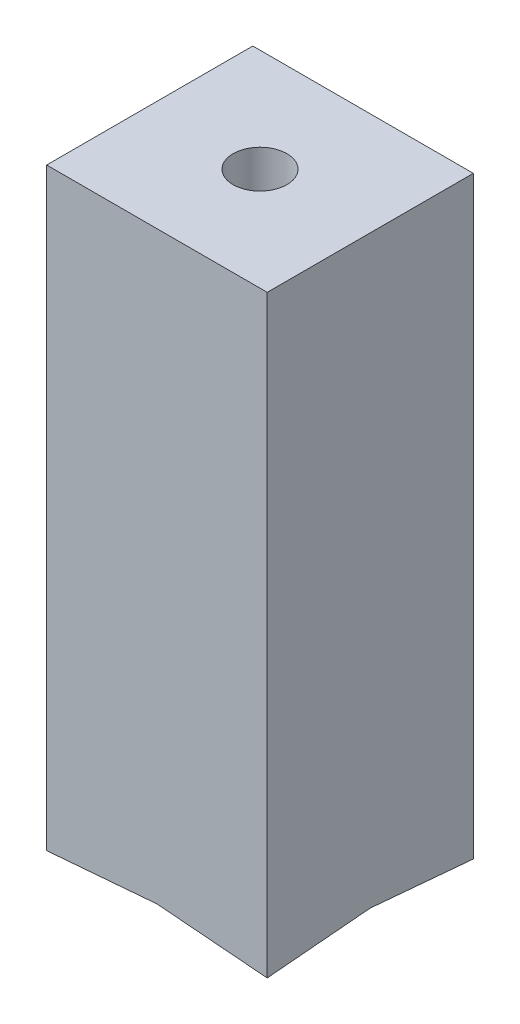
ISO-10303-21;
HEADER;
FILE_DESCRIPTION(('STEP AP214'),'2;1');
FILE_NAME('part.step','',(''),(''),'','','');
FILE_SCHEMA(('AUTOMOTIVE_DESIGN { 1 0 10303 214 1 1 1 1 }'));
ENDSEC;
DATA;
#1=APPLICATION_CONTEXT('core data for automotive mechanical design processes');
#2=APPLICATION_PROTOCOL_DEFINITION('international standard','automotive_design',2000,#1);
#3=PRODUCT_CONTEXT('',#1,'mechanical');
#4=PRODUCT('Part','Part','',(#3));
#5=PRODUCT_RELATED_PRODUCT_CATEGORY('part','',(#4));
#6=PRODUCT_DEFINITION_FORMATION('','',#4);
#7=PRODUCT_DEFINITION_CONTEXT('part definition',#1,'design');
#8=PRODUCT_DEFINITION('design','',#6,#7);
#9=PRODUCT_DEFINITION_SHAPE('','',#8);
#10=(LENGTH_UNIT() NAMED_UNIT(*) SI_UNIT(.MILLI.,.METRE.));
#11=(NAMED_UNIT(*) PLANE_ANGLE_UNIT() SI_UNIT($,.RADIAN.));
#12=(NAMED_UNIT(*) SI_UNIT($,.STERADIAN.) SOLID_ANGLE_UNIT());
#13=UNCERTAINTY_MEASURE_WITH_UNIT(LENGTH_MEASURE(1.E-05),#10,'distance_accuracy_value','');
#14=(GEOMETRIC_REPRESENTATION_CONTEXT(3) GLOBAL_UNCERTAINTY_ASSIGNED_CONTEXT((#13)) GLOBAL_UNIT_ASSIGNED_CONTEXT((#10,
#11,#12)) REPRESENTATION_CONTEXT('',''));
#15=CARTESIAN_POINT('',(0.,0.,0.));
#16=DIRECTION('',(0.,0.,1.));
#17=DIRECTION('',(1.,0.,0.));
#18=AXIS2_PLACEMENT_3D('',#15,#16,#17);
#19=CARTESIAN_POINT('',(-10.25,-55.2,9.58));
#20=DIRECTION('',(0.,0.996194698091746,0.0871557427476505));
#21=DIRECTION('',(0.,-0.0871557427476505,0.996194698091746));
#22=AXIS2_PLACEMENT_3D('',#19,#20,#21);
#23=PLANE('',#22);
#24=DIRECTION('',(0.,-0.0871557427476505,0.996194698091746));
#25=VECTOR('',#24,1.);
#26=CARTESIAN_POINT('',(10.25,-55.2,9.58));
#27=LINE('',#26,#25);
#28=CARTESIAN_POINT('',(10.25,-54.3618586034217,0.));
#29=VERTEX_POINT('',#28);
#30=CARTESIAN_POINT('',(10.25,-55.2,9.58));
#31=VERTEX_POINT('',#30);
#32=EDGE_CURVE('E148',#29,#31,#27,.T.);
#33=ORIENTED_EDGE('',*,*,#32,.T.);
#34=DIRECTION('',(-0.729280871698122,0.0596332183710134,-0.681610804962732));
#35=VECTOR('',#34,1.);
#36=CARTESIAN_POINT('',(-0.652937091407825,-54.3084680077466,-0.610257301042623));
#37=LINE('',#36,#35);
#38=CARTESIAN_POINT('',(0.,-54.3618586034217,0.));
#39=VERTEX_POINT('',#38);
#40=EDGE_CURVE('E140',#31,#39,#37,.T.);
#41=ORIENTED_EDGE('',*,*,#40,.T.);
#42=DIRECTION('',(1.,0.,0.));
#43=VECTOR('',#42,1.);
#44=CARTESIAN_POINT('',(-10.25,-54.3618586034217,0.));
#45=LINE('',#44,#43);
#46=EDGE_CURVE('E151',#39,#29,#45,.T.);
#47=ORIENTED_EDGE('',*,*,#46,.T.);
#48=EDGE_LOOP('',(#33,#41,#47));
#49=FACE_BOUND('',#48,.T.);
#50=ADVANCED_FACE('F51',(#49),#23,.F.);
#51=CARTESIAN_POINT('',(-10.25,-54.3618586034217,0.));
#52=DIRECTION('',(0.,0.996194698091746,-0.0871557427476505));
#53=DIRECTION('',(0.,0.0871557427476505,0.996194698091746));
#54=AXIS2_PLACEMENT_3D('',#51,#52,#53);
#55=PLANE('',#54);
#56=ORIENTED_EDGE('',*,*,#46,.F.);
#57=DIRECTION('',(0.729280871698122,-0.0596332183710134,-0.681610804962732));
#58=VECTOR('',#57,1.);
#59=CARTESIAN_POINT('',(-5.45146854570391,-53.916092607295,5.09512865052131));
#60=LINE('',#59,#58);
#61=CARTESIAN_POINT('',(10.25,-55.2,-9.58));
#62=VERTEX_POINT('',#61);
#63=EDGE_CURVE('E11',#39,#62,#60,.T.);
#64=ORIENTED_EDGE('',*,*,#63,.T.);
#65=DIRECTION('',(0.,0.0871557427476505,0.996194698091746));
#66=VECTOR('',#65,1.);
#67=CARTESIAN_POINT('',(10.25,-54.3618586034217,0.));
#68=LINE('',#67,#66);
#69=EDGE_CURVE('E143',#62,#29,#68,.T.);
#70=ORIENTED_EDGE('',*,*,#69,.T.);
#71=EDGE_LOOP('',(#56,#64,#70));
#72=FACE_BOUND('',#71,.T.);
#73=ADVANCED_FACE('F190',(#72),#55,.F.);
#74=CARTESIAN_POINT('',(10.25,-55.2,9.58));
#75=DIRECTION('',(1.,0.,0.));
#76=DIRECTION('',(0.,0.,-1.));
#77=AXIS2_PLACEMENT_3D('',#74,#75,#76);
#78=PLANE('',#77);
#79=ORIENTED_EDGE('',*,*,#32,.F.);
#80=ORIENTED_EDGE('',*,*,#69,.F.);
#81=DIRECTION('',(0.,1.,0.));
#82=VECTOR('',#81,1.);
#83=CARTESIAN_POINT('',(10.25,-55.2,-9.58));
#84=LINE('',#83,#82);
#85=CARTESIAN_POINT('',(10.25,0.,-9.58));
#86=VERTEX_POINT('',#85);
#87=EDGE_CURVE('E171',#62,#86,#84,.T.);
#88=ORIENTED_EDGE('',*,*,#87,.T.);
#89=DIRECTION('',(0.,0.,-1.));
#90=VECTOR('',#89,1.);
#91=CARTESIAN_POINT('',(10.25,0.,9.58));
#92=LINE('',#91,#90);
#93=CARTESIAN_POINT('',(10.25,0.,9.58));
#94=VERTEX_POINT('',#93);
#95=EDGE_CURVE('E159',#94,#86,#92,.T.);
#96=ORIENTED_EDGE('',*,*,#95,.F.);
#97=DIRECTION('',(0.,1.,0.));
#98=VECTOR('',#97,1.);
#99=CARTESIAN_POINT('',(10.25,-55.2,9.58));
#100=LINE('',#99,#98);
#101=EDGE_CURVE('E74',#31,#94,#100,.T.);
#102=ORIENTED_EDGE('',*,*,#101,.F.);
#103=EDGE_LOOP('',(#79,#80,#88,#96,#102));
#104=FACE_BOUND('',#103,.T.);
#105=ADVANCED_FACE('F53',(#104),#78,.T.);
#106=CARTESIAN_POINT('',(-10.25,-55.2,9.58));
#107=DIRECTION('',(0.,0.,1.));
#108=DIRECTION('',(1.,0.,0.));
#109=AXIS2_PLACEMENT_3D('',#106,#107,#108);
#110=PLANE('',#109);
#111=DIRECTION('',(0.996673514536741,-0.0814978859908687,0.));
#112=VECTOR('',#111,1.);
#113=CARTESIAN_POINT('',(10.25,-55.2,9.58));
#114=LINE('',#113,#112);
#115=CARTESIAN_POINT('',(0.,-54.3618586034217,9.58));
#116=VERTEX_POINT('',#115);
#117=EDGE_CURVE('E132',#116,#31,#114,.T.);
#118=ORIENTED_EDGE('',*,*,#117,.T.);
#119=ORIENTED_EDGE('',*,*,#101,.T.);
#120=DIRECTION('',(1.,0.,0.));
#121=VECTOR('',#120,1.);
#122=CARTESIAN_POINT('',(-10.25,0.,9.58));
#123=LINE('',#122,#121);
#124=CARTESIAN_POINT('',(-10.25,0.,9.58));
#125=VERTEX_POINT('',#124);
#126=EDGE_CURVE('E168',#125,#94,#123,.T.);
#127=ORIENTED_EDGE('',*,*,#126,.F.);
#128=DIRECTION('',(0.,1.,0.));
#129=VECTOR('',#128,1.);
#130=CARTESIAN_POINT('',(-10.25,-55.2,9.58));
#131=LINE('',#130,#129);
#132=CARTESIAN_POINT('',(-10.25,-55.2,9.58));
#133=VERTEX_POINT('',#132);
#134=EDGE_CURVE('E173',#133,#125,#131,.T.);
#135=ORIENTED_EDGE('',*,*,#134,.F.);
#136=DIRECTION('',(0.996673514536741,0.0814978859908687,0.));
#137=VECTOR('',#136,1.);
#138=CARTESIAN_POINT('',(0.,-54.3618586034217,9.58));
#139=LINE('',#138,#137);
#140=EDGE_CURVE('E129',#133,#116,#139,.T.);
#141=ORIENTED_EDGE('',*,*,#140,.T.);
#142=EDGE_LOOP('',(#118,#119,#127,#135,#141));
#143=FACE_BOUND('',#142,.T.);
#144=ADVANCED_FACE('F196',(#143),#110,.T.);
#145=CARTESIAN_POINT('',(-10.25,-55.2,9.58));
#146=DIRECTION('',(-1.,0.,0.));
#147=DIRECTION('',(0.,0.,1.));
#148=AXIS2_PLACEMENT_3D('',#145,#146,#147);
#149=PLANE('',#148);
#150=DIRECTION('',(0.,-0.0871557427476505,0.996194698091746));
#151=VECTOR('',#150,1.);
#152=CARTESIAN_POINT('',(-10.25,-55.2,9.58));
#153=LINE('',#152,#151);
#154=CARTESIAN_POINT('',(-10.25,-54.3618586034217,0.));
#155=VERTEX_POINT('',#154);
#156=EDGE_CURVE('E147',#155,#133,#153,.T.);
#157=ORIENTED_EDGE('',*,*,#156,.T.);
#158=ORIENTED_EDGE('',*,*,#134,.T.);
#159=DIRECTION('',(0.,0.,1.));
#160=VECTOR('',#159,1.);
#161=CARTESIAN_POINT('',(-10.25,0.,9.58));
#162=LINE('',#161,#160);
#163=CARTESIAN_POINT('',(-10.25,0.,-9.58));
#164=VERTEX_POINT('',#163);
#165=EDGE_CURVE('E165',#164,#125,#162,.T.);
#166=ORIENTED_EDGE('',*,*,#165,.F.);
#167=DIRECTION('',(0.,1.,0.));
#168=VECTOR('',#167,1.);
#169=CARTESIAN_POINT('',(-10.25,-55.2,-9.58));
#170=LINE('',#169,#168);
#171=CARTESIAN_POINT('',(-10.25,-55.2,-9.58));
#172=VERTEX_POINT('',#171);
#173=EDGE_CURVE('E175',#172,#164,#170,.T.);
#174=ORIENTED_EDGE('',*,*,#173,.F.);
#175=DIRECTION('',(0.,0.0871557427476505,0.996194698091746));
#176=VECTOR('',#175,1.);
#177=CARTESIAN_POINT('',(-10.25,-54.3618586034217,0.));
#178=LINE('',#177,#176);
#179=EDGE_CURVE('E144',#172,#155,#178,.T.);
#180=ORIENTED_EDGE('',*,*,#179,.T.);
#181=EDGE_LOOP('',(#157,#158,#166,#174,#180));
#182=FACE_BOUND('',#181,.T.);
#183=ADVANCED_FACE('F212',(#182),#149,.T.);
#184=CARTESIAN_POINT('',(-10.25,-55.2,-9.58));
#185=DIRECTION('',(0.,0.,-1.));
#186=DIRECTION('',(-1.,0.,0.));
#187=AXIS2_PLACEMENT_3D('',#184,#185,#186);
#188=PLANE('',#187);
#189=DIRECTION('',(0.996673514536741,-0.0814978859908687,0.));
#190=VECTOR('',#189,1.);
#191=CARTESIAN_POINT('',(10.25,-55.2,-9.58));
#192=LINE('',#191,#190);
#193=CARTESIAN_POINT('',(0.,-54.3618586034217,-9.58));
#194=VERTEX_POINT('',#193);
#195=EDGE_CURVE('E124',#194,#62,#192,.T.);
#196=ORIENTED_EDGE('',*,*,#195,.F.);
#197=DIRECTION('',(0.996673514536741,0.0814978859908687,0.));
#198=VECTOR('',#197,1.);
#199=CARTESIAN_POINT('',(0.,-54.3618586034217,-9.58));
#200=LINE('',#199,#198);
#201=EDGE_CURVE('E120',#172,#194,#200,.T.);
#202=ORIENTED_EDGE('',*,*,#201,.F.);
#203=ORIENTED_EDGE('',*,*,#173,.T.);
#204=DIRECTION('',(-1.,0.,0.));
#205=VECTOR('',#204,1.);
#206=CARTESIAN_POINT('',(-10.25,0.,-9.58));
#207=LINE('',#206,#205);
#208=EDGE_CURVE('E162',#86,#164,#207,.T.);
#209=ORIENTED_EDGE('',*,*,#208,.F.);
#210=ORIENTED_EDGE('',*,*,#87,.F.);
#211=EDGE_LOOP('',(#196,#202,#203,#209,#210));
#212=FACE_BOUND('',#211,.T.);
#213=ADVANCED_FACE('F205',(#212),#188,.T.);
#214=CARTESIAN_POINT('',(0.,0.,0.));
#215=DIRECTION('',(0.,-1.,0.));
#216=DIRECTION('',(0.,0.,-1.));
#217=AXIS2_PLACEMENT_3D('',#214,#215,#216);
#218=PLANE('',#217);
#219=CARTESIAN_POINT('',(0.,0.,0.));
#220=DIRECTION('',(0.,1.,0.));
#221=DIRECTION('',(0.,0.,1.));
#222=AXIS2_PLACEMENT_3D('',#219,#220,#221);
#223=CIRCLE('',#222,2.49999999999999);
#224=CARTESIAN_POINT('',(0.,0.,2.49999999999999));
#225=VERTEX_POINT('',#224);
#226=EDGE_CURVE('E121',#225,#225,#223,.T.);
#227=ORIENTED_EDGE('',*,*,#226,.F.);
#228=EDGE_LOOP('',(#227));
#229=FACE_BOUND('',#228,.T.);
#230=ORIENTED_EDGE('',*,*,#95,.T.);
#231=ORIENTED_EDGE('',*,*,#208,.T.);
#232=ORIENTED_EDGE('',*,*,#165,.T.);
#233=ORIENTED_EDGE('',*,*,#126,.T.);
#234=EDGE_LOOP('',(#230,#231,#232,#233));
#235=FACE_BOUND('',#234,.T.);
#236=ADVANCED_FACE('F209',(#229,#235),#218,.F.);
#237=EDGE_CURVE('E156',#155,#39,#45,.T.);
#238=ORIENTED_EDGE('',*,*,#237,.T.);
#239=DIRECTION('',(-0.729280871698122,-0.0596332183710134,0.681610804962732));
#240=VECTOR('',#239,1.);
#241=CARTESIAN_POINT('',(-10.25,-55.2,9.58));
#242=LINE('',#241,#240);
#243=EDGE_CURVE('E137',#39,#133,#242,.T.);
#244=ORIENTED_EDGE('',*,*,#243,.T.);
#245=ORIENTED_EDGE('',*,*,#156,.F.);
#246=EDGE_LOOP('',(#238,#244,#245));
#247=FACE_BOUND('',#246,.T.);
#248=ADVANCED_FACE('F188',(#247),#23,.F.);
#249=ORIENTED_EDGE('',*,*,#179,.F.);
#250=DIRECTION('',(0.729280871698122,0.0596332183710134,0.681610804962732));
#251=VECTOR('',#250,1.);
#252=CARTESIAN_POINT('',(-5.45146854570391,-54.8076245995484,-5.09512865052131));
#253=LINE('',#252,#251);
#254=EDGE_CURVE('E59',#172,#39,#253,.T.);
#255=ORIENTED_EDGE('',*,*,#254,.T.);
#256=ORIENTED_EDGE('',*,*,#237,.F.);
#257=EDGE_LOOP('',(#249,#255,#256));
#258=FACE_BOUND('',#257,.T.);
#259=ADVANCED_FACE('F180',(#258),#55,.F.);
#260=CARTESIAN_POINT('',(0.,-54.3618586034217,9.58));
#261=DIRECTION('',(-0.0814978859908687,0.996673514536741,0.));
#262=DIRECTION('',(-0.996673514536741,-0.0814978859908687,0.));
#263=AXIS2_PLACEMENT_3D('',#260,#261,#262);
#264=PLANE('',#263);
#265=ORIENTED_EDGE('',*,*,#201,.T.);
#266=DIRECTION('',(0.,0.,-1.));
#267=VECTOR('',#266,1.);
#268=CARTESIAN_POINT('',(0.,-54.3618586034217,9.58));
#269=LINE('',#268,#267);
#270=EDGE_CURVE('E133',#39,#194,#269,.T.);
#271=ORIENTED_EDGE('',*,*,#270,.F.);
#272=ORIENTED_EDGE('',*,*,#254,.F.);
#273=EDGE_LOOP('',(#265,#271,#272));
#274=FACE_BOUND('',#273,.T.);
#275=ADVANCED_FACE('F199',(#274),#264,.F.);
#276=CARTESIAN_POINT('',(10.25,-55.2,9.58));
#277=DIRECTION('',(0.0814978859908687,0.996673514536741,0.));
#278=DIRECTION('',(-0.996673514536741,0.0814978859908687,0.));
#279=AXIS2_PLACEMENT_3D('',#276,#277,#278);
#280=PLANE('',#279);
#281=ORIENTED_EDGE('',*,*,#270,.T.);
#282=ORIENTED_EDGE('',*,*,#195,.T.);
#283=ORIENTED_EDGE('',*,*,#63,.F.);
#284=EDGE_LOOP('',(#281,#282,#283));
#285=FACE_BOUND('',#284,.T.);
#286=ADVANCED_FACE('F202',(#285),#280,.F.);
#287=ORIENTED_EDGE('',*,*,#117,.F.);
#288=EDGE_CURVE('E66',#116,#39,#269,.T.);
#289=ORIENTED_EDGE('',*,*,#288,.T.);
#290=ORIENTED_EDGE('',*,*,#40,.F.);
#291=EDGE_LOOP('',(#287,#289,#290));
#292=FACE_BOUND('',#291,.T.);
#293=ADVANCED_FACE('F195',(#292),#280,.F.);
#294=ORIENTED_EDGE('',*,*,#288,.F.);
#295=ORIENTED_EDGE('',*,*,#140,.F.);
#296=ORIENTED_EDGE('',*,*,#243,.F.);
#297=EDGE_LOOP('',(#294,#295,#296));
#298=FACE_BOUND('',#297,.T.);
#299=ADVANCED_FACE('F114',(#298),#264,.F.);
#300=CARTESIAN_POINT('',(0.,-15.,0.));
#301=DIRECTION('',(0.,1.,0.));
#302=DIRECTION('',(0.,0.,1.));
#303=AXIS2_PLACEMENT_3D('',#300,#301,#302);
#304=CONICAL_SURFACE('',#303,2.49999999999999,1.02974425867665);
#305=CARTESIAN_POINT('',(0.,-16.5021515475689,0.));
#306=VERTEX_POINT('',#305);
#307=VERTEX_LOOP('',#306);
#308=FACE_BOUND('',#307,.T.);
#309=CARTESIAN_POINT('',(0.,-15.,0.));
#310=DIRECTION('',(0.,1.,0.));
#311=DIRECTION('',(0.,0.,1.));
#312=AXIS2_PLACEMENT_3D('',#309,#310,#311);
#313=CIRCLE('',#312,2.49999999999999);
#314=CARTESIAN_POINT('',(0.,-15.,2.49999999999999));
#315=VERTEX_POINT('',#314);
#316=EDGE_CURVE('E118',#315,#315,#313,.T.);
#317=ORIENTED_EDGE('',*,*,#316,.T.);
#318=EDGE_LOOP('',(#317));
#319=FACE_BOUND('',#318,.T.);
#320=ADVANCED_FACE('F110',(#308,#319),#304,.F.);
#321=CARTESIAN_POINT('',(0.,0.,0.));
#322=DIRECTION('',(0.,1.,0.));
#323=DIRECTION('',(0.,0.,1.));
#324=AXIS2_PLACEMENT_3D('',#321,#322,#323);
#325=CYLINDRICAL_SURFACE('',#324,2.49999999999999);
#326=ORIENTED_EDGE('',*,*,#316,.F.);
#327=EDGE_LOOP('',(#326));
#328=FACE_BOUND('',#327,.T.);
#329=ORIENTED_EDGE('',*,*,#226,.T.);
#330=EDGE_LOOP('',(#329));
#331=FACE_BOUND('',#330,.T.);
#332=ADVANCED_FACE('F113',(#328,#331),#325,.F.);
#333=CLOSED_SHELL('',(#50,#73,#105,#144,#183,#213,#236,#248,#259,#275,#286,#293,#299,#320,#332));
#334=MANIFOLD_SOLID_BREP('B2',#333);
#335=ADVANCED_BREP_SHAPE_REPRESENTATION('',(#18,#334),#14);
#336=SHAPE_DEFINITION_REPRESENTATION(#9,#335);
ENDSEC;
END-ISO-10303-21;
